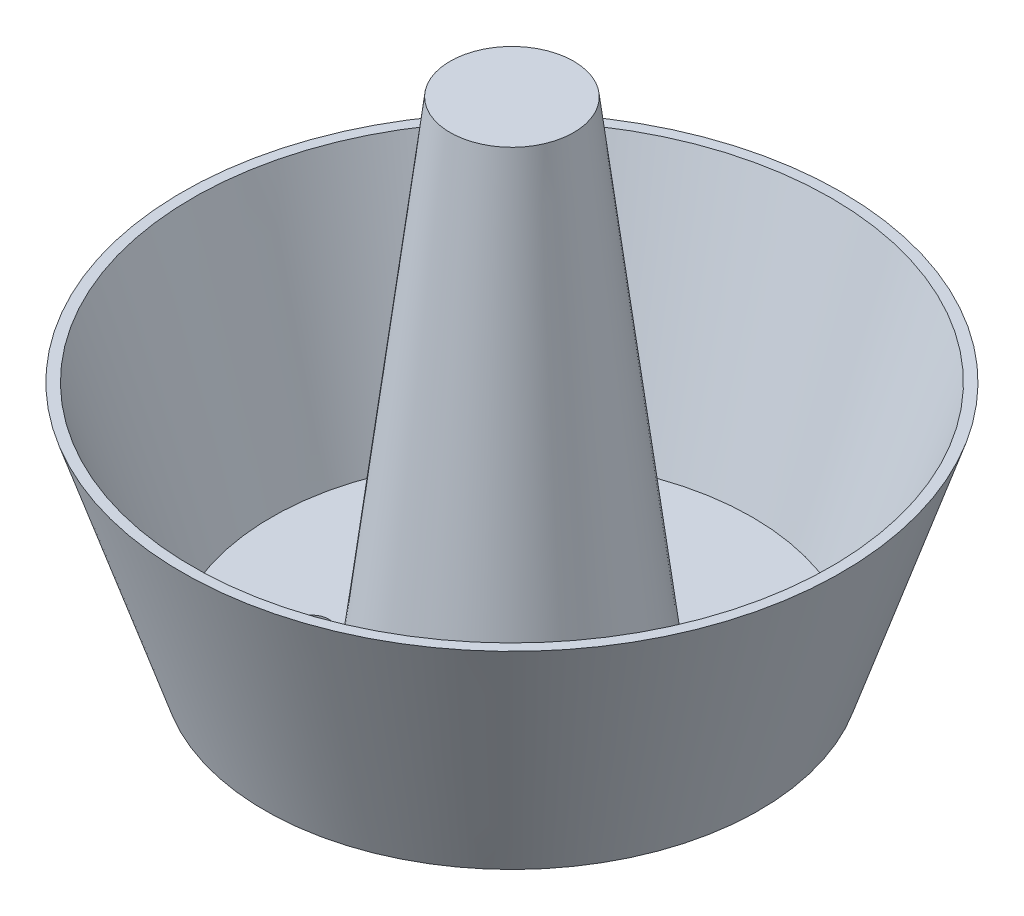
ISO-10303-21;
HEADER;
FILE_DESCRIPTION(('STEP AP214'),'2;1');
FILE_NAME('part.step','',(''),(''),'','','');
FILE_SCHEMA(('AUTOMOTIVE_DESIGN { 1 0 10303 214 1 1 1 1 }'));
ENDSEC;
DATA;
#1=APPLICATION_CONTEXT('core data for automotive mechanical design processes');
#2=APPLICATION_PROTOCOL_DEFINITION('international standard','automotive_design',2000,#1);
#3=PRODUCT_CONTEXT('',#1,'mechanical');
#4=PRODUCT('Part','Part','',(#3));
#5=PRODUCT_RELATED_PRODUCT_CATEGORY('part','',(#4));
#6=PRODUCT_DEFINITION_FORMATION('','',#4);
#7=PRODUCT_DEFINITION_CONTEXT('part definition',#1,'design');
#8=PRODUCT_DEFINITION('design','',#6,#7);
#9=PRODUCT_DEFINITION_SHAPE('','',#8);
#10=(LENGTH_UNIT() NAMED_UNIT(*) SI_UNIT(.MILLI.,.METRE.));
#11=(NAMED_UNIT(*) PLANE_ANGLE_UNIT() SI_UNIT($,.RADIAN.));
#12=(NAMED_UNIT(*) SI_UNIT($,.STERADIAN.) SOLID_ANGLE_UNIT());
#13=UNCERTAINTY_MEASURE_WITH_UNIT(LENGTH_MEASURE(1.E-05),#10,'distance_accuracy_value','');
#14=(GEOMETRIC_REPRESENTATION_CONTEXT(3) GLOBAL_UNCERTAINTY_ASSIGNED_CONTEXT((#13)) GLOBAL_UNIT_ASSIGNED_CONTEXT((#10,
#11,#12)) REPRESENTATION_CONTEXT('',''));
#15=CARTESIAN_POINT('',(0.,0.,0.));
#16=DIRECTION('',(0.,0.,1.));
#17=DIRECTION('',(1.,0.,0.));
#18=AXIS2_PLACEMENT_3D('',#15,#16,#17);
#19=CARTESIAN_POINT('',(76.2,0.,0.));
#20=DIRECTION('',(0.,-1.,0.));
#21=DIRECTION('',(0.,0.,-1.));
#22=AXIS2_PLACEMENT_3D('',#19,#20,#21);
#23=PLANE('',#22);
#24=CARTESIAN_POINT('',(0.,0.,0.));
#25=DIRECTION('',(0.,-1.,0.));
#26=DIRECTION('',(0.,0.,-1.));
#27=AXIS2_PLACEMENT_3D('',#24,#25,#26);
#28=CIRCLE('',#27,76.2);
#29=CARTESIAN_POINT('',(0.,0.,-76.2));
#30=VERTEX_POINT('',#29);
#31=EDGE_CURVE('E56',#30,#30,#28,.T.);
#32=ORIENTED_EDGE('',*,*,#31,.T.);
#33=EDGE_LOOP('',(#32));
#34=FACE_BOUND('',#33,.T.);
#35=CARTESIAN_POINT('',(38.1,0.,23.4937906120081));
#36=DIRECTION('',(0.,-1.,0.));
#37=DIRECTION('',(0.,0.,-1.));
#38=AXIS2_PLACEMENT_3D('',#35,#36,#37);
#39=CIRCLE('',#38,5.04189999999999);
#40=CARTESIAN_POINT('',(38.1,0.,18.4518906120081));
#41=VERTEX_POINT('',#40);
#42=EDGE_CURVE('E62',#41,#41,#39,.T.);
#43=ORIENTED_EDGE('',*,*,#42,.F.);
#44=EDGE_LOOP('',(#43));
#45=FACE_BOUND('',#44,.T.);
#46=CARTESIAN_POINT('',(-38.1,0.,23.4937906120081));
#47=DIRECTION('',(0.,-1.,0.));
#48=DIRECTION('',(0.,0.,-1.));
#49=AXIS2_PLACEMENT_3D('',#46,#47,#48);
#50=CIRCLE('',#49,5.04189999999999);
#51=CARTESIAN_POINT('',(-38.1,0.,18.4518906120081));
#52=VERTEX_POINT('',#51);
#53=EDGE_CURVE('E68',#52,#52,#50,.T.);
#54=ORIENTED_EDGE('',*,*,#53,.F.);
#55=EDGE_LOOP('',(#54));
#56=FACE_BOUND('',#55,.T.);
#57=CARTESIAN_POINT('',(0.,0.,0.));
#58=DIRECTION('',(0.,-1.,0.));
#59=DIRECTION('',(0.,0.,-1.));
#60=AXIS2_PLACEMENT_3D('',#57,#58,#59);
#61=CIRCLE('',#60,12.7);
#62=CARTESIAN_POINT('',(0.,0.,-12.7));
#63=VERTEX_POINT('',#62);
#64=EDGE_CURVE('E72',#63,#63,#61,.T.);
#65=ORIENTED_EDGE('',*,*,#64,.F.);
#66=EDGE_LOOP('',(#65));
#67=FACE_BOUND('',#66,.T.);
#68=ADVANCED_FACE('F33',(#34,#45,#56,#67),#23,.T.);
#69=CARTESIAN_POINT('',(0.,152.4,0.));
#70=DIRECTION('',(0.,1.,0.));
#71=DIRECTION('',(0.,0.,1.));
#72=AXIS2_PLACEMENT_3D('',#69,#70,#71);
#73=PLANE('',#72);
#74=CARTESIAN_POINT('',(0.,152.4,0.));
#75=DIRECTION('',(0.,-1.,0.));
#76=DIRECTION('',(0.,0.,-1.));
#77=AXIS2_PLACEMENT_3D('',#74,#75,#76);
#78=CIRCLE('',#77,19.05);
#79=CARTESIAN_POINT('',(0.,152.4,-19.05));
#80=VERTEX_POINT('',#79);
#81=EDGE_CURVE('E10',#80,#80,#78,.T.);
#82=ORIENTED_EDGE('',*,*,#81,.F.);
#83=EDGE_LOOP('',(#82));
#84=FACE_BOUND('',#83,.T.);
#85=ADVANCED_FACE('F35',(#84),#73,.T.);
#86=CARTESIAN_POINT('',(0.,3.175,0.));
#87=DIRECTION('',(0.,-1.,0.));
#88=DIRECTION('',(0.,0.,-1.));
#89=AXIS2_PLACEMENT_3D('',#86,#87,#88);
#90=CONICAL_SURFACE('',#89,37.3412200596098,0.121966367380008);
#91=ORIENTED_EDGE('',*,*,#81,.T.);
#92=EDGE_LOOP('',(#91));
#93=FACE_BOUND('',#92,.T.);
#94=CARTESIAN_POINT('',(0.,3.175,0.));
#95=DIRECTION('',(0.,-1.,0.));
#96=DIRECTION('',(0.,0.,-1.));
#97=AXIS2_PLACEMENT_3D('',#94,#95,#96);
#98=CIRCLE('',#97,37.3412200596098);
#99=CARTESIAN_POINT('',(0.,3.175,-37.3412200596098));
#100=VERTEX_POINT('',#99);
#101=EDGE_CURVE('E40',#100,#100,#98,.T.);
#102=ORIENTED_EDGE('',*,*,#101,.F.);
#103=EDGE_LOOP('',(#102));
#104=FACE_BOUND('',#103,.T.);
#105=ADVANCED_FACE('F95',(#93,#104),#90,.T.);
#106=CARTESIAN_POINT('',(37.3412200596098,3.175,0.));
#107=DIRECTION('',(0.,1.,0.));
#108=DIRECTION('',(0.,0.,1.));
#109=AXIS2_PLACEMENT_3D('',#106,#107,#108);
#110=PLANE('',#109);
#111=CARTESIAN_POINT('',(-38.1,3.175,23.4937906120081));
#112=DIRECTION('',(0.,1.,0.));
#113=DIRECTION('',(0.,0.,1.));
#114=AXIS2_PLACEMENT_3D('',#111,#112,#113);
#115=CIRCLE('',#114,5.04189999999999);
#116=CARTESIAN_POINT('',(-38.1,3.175,28.5356906120081));
#117=VERTEX_POINT('',#116);
#118=EDGE_CURVE('E65',#117,#117,#115,.T.);
#119=ORIENTED_EDGE('',*,*,#118,.F.);
#120=EDGE_LOOP('',(#119));
#121=FACE_BOUND('',#120,.T.);
#122=CARTESIAN_POINT('',(38.1,3.175,23.4937906120081));
#123=DIRECTION('',(0.,1.,0.));
#124=DIRECTION('',(0.,0.,1.));
#125=AXIS2_PLACEMENT_3D('',#122,#123,#124);
#126=CIRCLE('',#125,5.04189999999999);
#127=CARTESIAN_POINT('',(38.1,3.175,28.5356906120081));
#128=VERTEX_POINT('',#127);
#129=EDGE_CURVE('E59',#128,#128,#126,.T.);
#130=ORIENTED_EDGE('',*,*,#129,.F.);
#131=EDGE_LOOP('',(#130));
#132=FACE_BOUND('',#131,.T.);
#133=ORIENTED_EDGE('',*,*,#101,.T.);
#134=EDGE_LOOP('',(#133));
#135=FACE_BOUND('',#134,.T.);
#136=CARTESIAN_POINT('',(0.,3.17499999999999,0.));
#137=DIRECTION('',(0.,-1.,0.));
#138=DIRECTION('',(0.,0.,-1.));
#139=AXIS2_PLACEMENT_3D('',#136,#137,#138);
#140=CIRCLE('',#139,74.0833333333333);
#141=CARTESIAN_POINT('',(0.,3.17499999999999,-74.0833333333333));
#142=VERTEX_POINT('',#141);
#143=EDGE_CURVE('E44',#142,#142,#140,.T.);
#144=ORIENTED_EDGE('',*,*,#143,.F.);
#145=EDGE_LOOP('',(#144));
#146=FACE_BOUND('',#145,.T.);
#147=ADVANCED_FACE('F113',(#121,#132,#135,#146),#110,.T.);
#148=CARTESIAN_POINT('',(0.,76.2,0.));
#149=DIRECTION('',(0.,1.,0.));
#150=DIRECTION('',(0.,0.,1.));
#151=AXIS2_PLACEMENT_3D('',#148,#149,#150);
#152=CONICAL_SURFACE('',#151,98.425,0.321750554396642);
#153=ORIENTED_EDGE('',*,*,#143,.T.);
#154=EDGE_LOOP('',(#153));
#155=FACE_BOUND('',#154,.T.);
#156=CARTESIAN_POINT('',(0.,76.2,0.));
#157=DIRECTION('',(0.,-1.,0.));
#158=DIRECTION('',(0.,0.,-1.));
#159=AXIS2_PLACEMENT_3D('',#156,#157,#158);
#160=CIRCLE('',#159,98.425);
#161=CARTESIAN_POINT('',(0.,76.2,-98.425));
#162=VERTEX_POINT('',#161);
#163=EDGE_CURVE('E48',#162,#162,#160,.T.);
#164=ORIENTED_EDGE('',*,*,#163,.F.);
#165=EDGE_LOOP('',(#164));
#166=FACE_BOUND('',#165,.T.);
#167=ADVANCED_FACE('F109',(#155,#166),#152,.F.);
#168=CARTESIAN_POINT('',(98.425,76.2,0.));
#169=DIRECTION('',(0.,1.,0.));
#170=DIRECTION('',(0.,0.,1.));
#171=AXIS2_PLACEMENT_3D('',#168,#169,#170);
#172=PLANE('',#171);
#173=ORIENTED_EDGE('',*,*,#163,.T.);
#174=EDGE_LOOP('',(#173));
#175=FACE_BOUND('',#174,.T.);
#176=CARTESIAN_POINT('',(0.,76.2,0.));
#177=DIRECTION('',(0.,-1.,0.));
#178=DIRECTION('',(0.,0.,-1.));
#179=AXIS2_PLACEMENT_3D('',#176,#177,#178);
#180=CIRCLE('',#179,101.6);
#181=CARTESIAN_POINT('',(0.,76.2,-101.6));
#182=VERTEX_POINT('',#181);
#183=EDGE_CURVE('E53',#182,#182,#180,.T.);
#184=ORIENTED_EDGE('',*,*,#183,.F.);
#185=EDGE_LOOP('',(#184));
#186=FACE_BOUND('',#185,.T.);
#187=ADVANCED_FACE('F105',(#175,#186),#172,.T.);
#188=CARTESIAN_POINT('',(0.,0.,0.));
#189=DIRECTION('',(0.,1.,0.));
#190=DIRECTION('',(0.,0.,1.));
#191=AXIS2_PLACEMENT_3D('',#188,#189,#190);
#192=CONICAL_SURFACE('',#191,76.2,0.321750554396642);
#193=ORIENTED_EDGE('',*,*,#183,.T.);
#194=EDGE_LOOP('',(#193));
#195=FACE_BOUND('',#194,.T.);
#196=ORIENTED_EDGE('',*,*,#31,.F.);
#197=EDGE_LOOP('',(#196));
#198=FACE_BOUND('',#197,.T.);
#199=ADVANCED_FACE('F102',(#195,#198),#192,.T.);
#200=CARTESIAN_POINT('',(38.1,0.,23.4937906120081));
#201=DIRECTION('',(0.,-1.,0.));
#202=DIRECTION('',(0.,0.,-1.));
#203=AXIS2_PLACEMENT_3D('',#200,#201,#202);
#204=CYLINDRICAL_SURFACE('',#203,5.04189999999999);
#205=ORIENTED_EDGE('',*,*,#129,.T.);
#206=EDGE_LOOP('',(#205));
#207=FACE_BOUND('',#206,.T.);
#208=ORIENTED_EDGE('',*,*,#42,.T.);
#209=EDGE_LOOP('',(#208));
#210=FACE_BOUND('',#209,.T.);
#211=ADVANCED_FACE('F100',(#207,#210),#204,.F.);
#212=CARTESIAN_POINT('',(-38.1,0.,23.4937906120081));
#213=DIRECTION('',(0.,-1.,0.));
#214=DIRECTION('',(0.,0.,-1.));
#215=AXIS2_PLACEMENT_3D('',#212,#213,#214);
#216=CYLINDRICAL_SURFACE('',#215,5.04189999999999);
#217=ORIENTED_EDGE('',*,*,#118,.T.);
#218=EDGE_LOOP('',(#217));
#219=FACE_BOUND('',#218,.T.);
#220=ORIENTED_EDGE('',*,*,#53,.T.);
#221=EDGE_LOOP('',(#220));
#222=FACE_BOUND('',#221,.T.);
#223=ADVANCED_FACE('F83',(#219,#222),#216,.F.);
#224=CARTESIAN_POINT('',(0.,-25.4,0.));
#225=DIRECTION('',(0.,1.,0.));
#226=DIRECTION('',(0.,0.,1.));
#227=AXIS2_PLACEMENT_3D('',#224,#225,#226);
#228=CYLINDRICAL_SURFACE('',#227,12.7);
#229=CARTESIAN_POINT('',(0.,-25.4,0.));
#230=DIRECTION('',(0.,-1.,0.));
#231=DIRECTION('',(0.,0.,-1.));
#232=AXIS2_PLACEMENT_3D('',#229,#230,#231);
#233=CIRCLE('',#232,12.7);
#234=CARTESIAN_POINT('',(0.,-25.4,-12.7));
#235=VERTEX_POINT('',#234);
#236=EDGE_CURVE('E71',#235,#235,#233,.T.);
#237=ORIENTED_EDGE('',*,*,#236,.F.);
#238=EDGE_LOOP('',(#237));
#239=FACE_BOUND('',#238,.T.);
#240=ORIENTED_EDGE('',*,*,#64,.T.);
#241=EDGE_LOOP('',(#240));
#242=FACE_BOUND('',#241,.T.);
#243=ADVANCED_FACE('F80',(#239,#242),#228,.T.);
#244=CARTESIAN_POINT('',(0.,-25.4,0.));
#245=DIRECTION('',(0.,-1.,0.));
#246=DIRECTION('',(0.,0.,-1.));
#247=AXIS2_PLACEMENT_3D('',#244,#245,#246);
#248=PLANE('',#247);
#249=ORIENTED_EDGE('',*,*,#236,.T.);
#250=EDGE_LOOP('',(#249));
#251=FACE_BOUND('',#250,.T.);
#252=ADVANCED_FACE('F78',(#251),#248,.T.);
#253=CLOSED_SHELL('',(#68,#85,#105,#147,#167,#187,#199,#211,#223,#243,#252));
#254=MANIFOLD_SOLID_BREP('B2',#253);
#255=ADVANCED_BREP_SHAPE_REPRESENTATION('',(#18,#254),#14);
#256=SHAPE_DEFINITION_REPRESENTATION(#9,#255);
ENDSEC;
END-ISO-10303-21;
